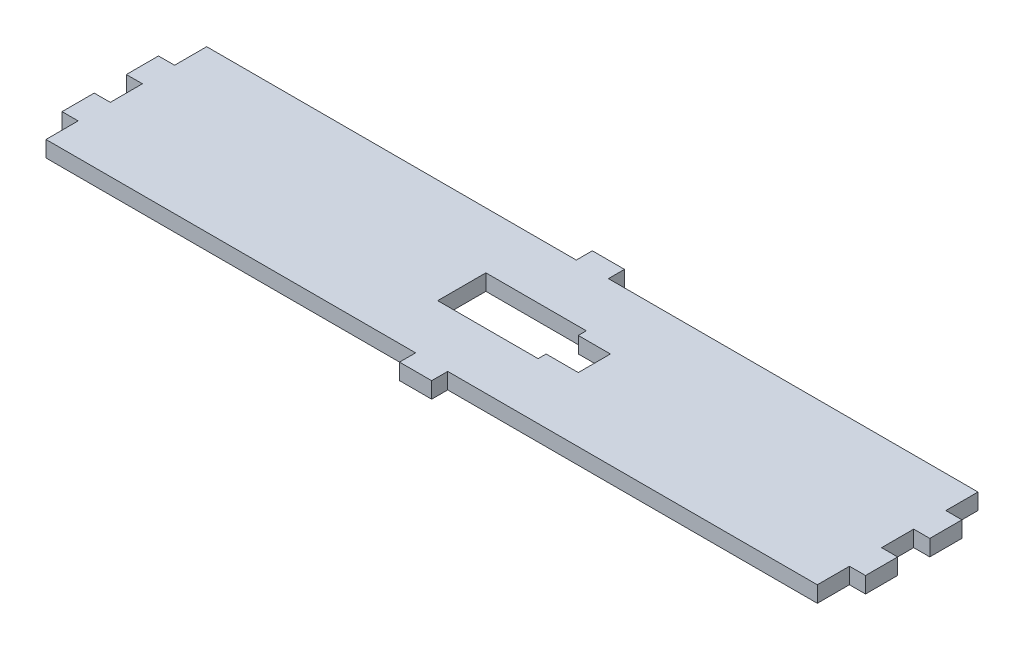
ISO-10303-21;
HEADER;
FILE_DESCRIPTION(('STEP AP214'),'2;1');
FILE_NAME('part.step','',(''),(''),'','','');
FILE_SCHEMA(('AUTOMOTIVE_DESIGN { 1 0 10303 214 1 1 1 1 }'));
ENDSEC;
DATA;
#1=APPLICATION_CONTEXT('core data for automotive mechanical design processes');
#2=APPLICATION_PROTOCOL_DEFINITION('international standard','automotive_design',2000,#1);
#3=PRODUCT_CONTEXT('',#1,'mechanical');
#4=PRODUCT('Part','Part','',(#3));
#5=PRODUCT_RELATED_PRODUCT_CATEGORY('part','',(#4));
#6=PRODUCT_DEFINITION_FORMATION('','',#4);
#7=PRODUCT_DEFINITION_CONTEXT('part definition',#1,'design');
#8=PRODUCT_DEFINITION('design','',#6,#7);
#9=PRODUCT_DEFINITION_SHAPE('','',#8);
#10=(LENGTH_UNIT() NAMED_UNIT(*) SI_UNIT(.MILLI.,.METRE.));
#11=(NAMED_UNIT(*) PLANE_ANGLE_UNIT() SI_UNIT($,.RADIAN.));
#12=(NAMED_UNIT(*) SI_UNIT($,.STERADIAN.) SOLID_ANGLE_UNIT());
#13=UNCERTAINTY_MEASURE_WITH_UNIT(LENGTH_MEASURE(1.E-05),#10,'distance_accuracy_value','');
#14=(GEOMETRIC_REPRESENTATION_CONTEXT(3) GLOBAL_UNCERTAINTY_ASSIGNED_CONTEXT((#13)) GLOBAL_UNIT_ASSIGNED_CONTEXT((#10,
#11,#12)) REPRESENTATION_CONTEXT('',''));
#15=CARTESIAN_POINT('',(0.,0.,0.));
#16=DIRECTION('',(0.,0.,1.));
#17=DIRECTION('',(1.,0.,0.));
#18=AXIS2_PLACEMENT_3D('',#15,#16,#17);
#19=CARTESIAN_POINT('',(0.,6.35,-38.1));
#20=DIRECTION('',(0.,0.,-1.));
#21=DIRECTION('',(-1.,0.,0.));
#22=AXIS2_PLACEMENT_3D('',#19,#20,#21);
#23=PLANE('',#22);
#24=DIRECTION('',(1.,0.,0.));
#25=VECTOR('',#24,1.);
#26=CARTESIAN_POINT('',(0.,0.,-38.1));
#27=LINE('',#26,#25);
#28=CARTESIAN_POINT('',(172.24375,0.,-38.1));
#29=VERTEX_POINT('',#28);
#30=CARTESIAN_POINT('',(184.94375,0.,-38.1));
#31=VERTEX_POINT('',#30);
#32=EDGE_CURVE('E373',#29,#31,#27,.T.);
#33=ORIENTED_EDGE('',*,*,#32,.T.);
#34=DIRECTION('',(0.,-1.,0.));
#35=VECTOR('',#34,1.);
#36=CARTESIAN_POINT('',(184.94375,6.35,-38.1));
#37=LINE('',#36,#35);
#38=CARTESIAN_POINT('',(184.94375,6.35,-38.1));
#39=VERTEX_POINT('',#38);
#40=EDGE_CURVE('E11',#39,#31,#37,.T.);
#41=ORIENTED_EDGE('',*,*,#40,.F.);
#42=DIRECTION('',(1.,0.,0.));
#43=VECTOR('',#42,1.);
#44=CARTESIAN_POINT('',(0.,6.35,-38.1));
#45=LINE('',#44,#43);
#46=CARTESIAN_POINT('',(172.24375,6.35,-38.1));
#47=VERTEX_POINT('',#46);
#48=EDGE_CURVE('E590',#47,#39,#45,.T.);
#49=ORIENTED_EDGE('',*,*,#48,.F.);
#50=DIRECTION('',(0.,-1.,0.));
#51=VECTOR('',#50,1.);
#52=CARTESIAN_POINT('',(172.24375,6.35,-38.1));
#53=LINE('',#52,#51);
#54=EDGE_CURVE('E390',#47,#29,#53,.T.);
#55=ORIENTED_EDGE('',*,*,#54,.T.);
#56=EDGE_LOOP('',(#33,#41,#49,#55));
#57=FACE_BOUND('',#56,.T.);
#58=ADVANCED_FACE('F37',(#57),#23,.F.);
#59=CARTESIAN_POINT('',(184.94375,6.35,0.));
#60=DIRECTION('',(1.,0.,0.));
#61=DIRECTION('',(0.,0.,-1.));
#62=AXIS2_PLACEMENT_3D('',#59,#60,#61);
#63=PLANE('',#62);
#64=DIRECTION('',(0.,0.,1.));
#65=VECTOR('',#64,1.);
#66=CARTESIAN_POINT('',(184.94375,0.,0.));
#67=LINE('',#66,#65);
#68=CARTESIAN_POINT('',(184.94375,0.,-25.4));
#69=VERTEX_POINT('',#68);
#70=EDGE_CURVE('E376',#31,#69,#67,.T.);
#71=ORIENTED_EDGE('',*,*,#70,.T.);
#72=DIRECTION('',(0.,-1.,0.));
#73=VECTOR('',#72,1.);
#74=CARTESIAN_POINT('',(184.94375,6.35,-25.4));
#75=LINE('',#74,#73);
#76=CARTESIAN_POINT('',(184.94375,6.35,-25.4));
#77=VERTEX_POINT('',#76);
#78=EDGE_CURVE('E47',#77,#69,#75,.T.);
#79=ORIENTED_EDGE('',*,*,#78,.F.);
#80=DIRECTION('',(0.,0.,1.));
#81=VECTOR('',#80,1.);
#82=CARTESIAN_POINT('',(184.94375,6.35,0.));
#83=LINE('',#82,#81);
#84=EDGE_CURVE('E592',#39,#77,#83,.T.);
#85=ORIENTED_EDGE('',*,*,#84,.F.);
#86=ORIENTED_EDGE('',*,*,#40,.T.);
#87=EDGE_LOOP('',(#71,#79,#85,#86));
#88=FACE_BOUND('',#87,.T.);
#89=ADVANCED_FACE('F643',(#88),#63,.F.);
#90=CARTESIAN_POINT('',(0.,6.35,-25.4));
#91=DIRECTION('',(0.,0.,-1.));
#92=DIRECTION('',(-1.,0.,0.));
#93=AXIS2_PLACEMENT_3D('',#90,#91,#92);
#94=PLANE('',#93);
#95=DIRECTION('',(1.,0.,0.));
#96=VECTOR('',#95,1.);
#97=CARTESIAN_POINT('',(0.,0.,-25.4));
#98=LINE('',#97,#96);
#99=CARTESIAN_POINT('',(172.24375,0.,-25.4));
#100=VERTEX_POINT('',#99);
#101=EDGE_CURVE('E379',#100,#69,#98,.T.);
#102=ORIENTED_EDGE('',*,*,#101,.F.);
#103=DIRECTION('',(0.,-1.,0.));
#104=VECTOR('',#103,1.);
#105=CARTESIAN_POINT('',(172.24375,6.35,-25.4));
#106=LINE('',#105,#104);
#107=CARTESIAN_POINT('',(172.24375,6.35,-25.4));
#108=VERTEX_POINT('',#107);
#109=EDGE_CURVE('E396',#108,#100,#106,.T.);
#110=ORIENTED_EDGE('',*,*,#109,.F.);
#111=DIRECTION('',(1.,0.,0.));
#112=VECTOR('',#111,1.);
#113=CARTESIAN_POINT('',(0.,6.35,-25.4));
#114=LINE('',#113,#112);
#115=EDGE_CURVE('E594',#108,#77,#114,.T.);
#116=ORIENTED_EDGE('',*,*,#115,.T.);
#117=ORIENTED_EDGE('',*,*,#78,.T.);
#118=EDGE_LOOP('',(#102,#110,#116,#117));
#119=FACE_BOUND('',#118,.T.);
#120=ADVANCED_FACE('F649',(#119),#94,.T.);
#121=CARTESIAN_POINT('',(172.24375,6.35,0.));
#122=DIRECTION('',(1.,0.,0.));
#123=DIRECTION('',(0.,0.,-1.));
#124=AXIS2_PLACEMENT_3D('',#121,#122,#123);
#125=PLANE('',#124);
#126=DIRECTION('',(0.,0.,1.));
#127=VECTOR('',#126,1.);
#128=CARTESIAN_POINT('',(172.24375,0.,0.));
#129=LINE('',#128,#127);
#130=CARTESIAN_POINT('',(172.24375,0.,-22.225));
#131=VERTEX_POINT('',#130);
#132=EDGE_CURVE('E382',#100,#131,#129,.T.);
#133=ORIENTED_EDGE('',*,*,#132,.T.);
#134=DIRECTION('',(0.,-1.,0.));
#135=VECTOR('',#134,1.);
#136=CARTESIAN_POINT('',(172.24375,6.35,-22.225));
#137=LINE('',#136,#135);
#138=CARTESIAN_POINT('',(172.24375,6.35,-22.225));
#139=VERTEX_POINT('',#138);
#140=EDGE_CURVE('E394',#139,#131,#137,.T.);
#141=ORIENTED_EDGE('',*,*,#140,.F.);
#142=DIRECTION('',(0.,0.,1.));
#143=VECTOR('',#142,1.);
#144=CARTESIAN_POINT('',(172.24375,6.35,0.));
#145=LINE('',#144,#143);
#146=EDGE_CURVE('E301',#108,#139,#145,.T.);
#147=ORIENTED_EDGE('',*,*,#146,.F.);
#148=ORIENTED_EDGE('',*,*,#109,.T.);
#149=EDGE_LOOP('',(#133,#141,#147,#148));
#150=FACE_BOUND('',#149,.T.);
#151=ADVANCED_FACE('F600',(#150),#125,.F.);
#152=CARTESIAN_POINT('',(0.,6.35,-22.225));
#153=DIRECTION('',(0.,0.,-1.));
#154=DIRECTION('',(-1.,0.,0.));
#155=AXIS2_PLACEMENT_3D('',#152,#153,#154);
#156=PLANE('',#155);
#157=DIRECTION('',(1.,0.,0.));
#158=VECTOR('',#157,1.);
#159=CARTESIAN_POINT('',(0.,0.,-22.225));
#160=LINE('',#159,#158);
#161=CARTESIAN_POINT('',(132.55625,0.,-22.225));
#162=VERTEX_POINT('',#161);
#163=EDGE_CURVE('E385',#162,#131,#160,.T.);
#164=ORIENTED_EDGE('',*,*,#163,.F.);
#165=DIRECTION('',(0.,-1.,0.));
#166=VECTOR('',#165,1.);
#167=CARTESIAN_POINT('',(132.55625,6.35,-22.225));
#168=LINE('',#167,#166);
#169=CARTESIAN_POINT('',(132.55625,6.35,-22.225));
#170=VERTEX_POINT('',#169);
#171=EDGE_CURVE('E290',#170,#162,#168,.T.);
#172=ORIENTED_EDGE('',*,*,#171,.F.);
#173=DIRECTION('',(1.,0.,0.));
#174=VECTOR('',#173,1.);
#175=CARTESIAN_POINT('',(0.,6.35,-22.225));
#176=LINE('',#175,#174);
#177=EDGE_CURVE('E299',#170,#139,#176,.T.);
#178=ORIENTED_EDGE('',*,*,#177,.T.);
#179=ORIENTED_EDGE('',*,*,#140,.T.);
#180=EDGE_LOOP('',(#164,#172,#178,#179));
#181=FACE_BOUND('',#180,.T.);
#182=ADVANCED_FACE('F604',(#181),#156,.T.);
#183=CARTESIAN_POINT('',(132.55625,6.35,0.));
#184=DIRECTION('',(1.,0.,0.));
#185=DIRECTION('',(0.,0.,-1.));
#186=AXIS2_PLACEMENT_3D('',#183,#184,#185);
#187=PLANE('',#186);
#188=DIRECTION('',(0.,0.,1.));
#189=VECTOR('',#188,1.);
#190=CARTESIAN_POINT('',(132.55625,0.,0.));
#191=LINE('',#190,#189);
#192=CARTESIAN_POINT('',(132.55625,0.,-41.275));
#193=VERTEX_POINT('',#192);
#194=EDGE_CURVE('E289',#193,#162,#191,.T.);
#195=ORIENTED_EDGE('',*,*,#194,.F.);
#196=DIRECTION('',(0.,-1.,0.));
#197=VECTOR('',#196,1.);
#198=CARTESIAN_POINT('',(132.55625,6.35,-41.275));
#199=LINE('',#198,#197);
#200=CARTESIAN_POINT('',(132.55625,6.35,-41.275));
#201=VERTEX_POINT('',#200);
#202=EDGE_CURVE('E283',#201,#193,#199,.T.);
#203=ORIENTED_EDGE('',*,*,#202,.F.);
#204=DIRECTION('',(0.,0.,1.));
#205=VECTOR('',#204,1.);
#206=CARTESIAN_POINT('',(132.55625,6.35,0.));
#207=LINE('',#206,#205);
#208=EDGE_CURVE('E287',#201,#170,#207,.T.);
#209=ORIENTED_EDGE('',*,*,#208,.T.);
#210=ORIENTED_EDGE('',*,*,#171,.T.);
#211=EDGE_LOOP('',(#195,#203,#209,#210));
#212=FACE_BOUND('',#211,.T.);
#213=ADVANCED_FACE('F285',(#212),#187,.T.);
#214=CARTESIAN_POINT('',(0.,6.35,-41.275));
#215=DIRECTION('',(0.,0.,-1.));
#216=DIRECTION('',(-1.,0.,0.));
#217=AXIS2_PLACEMENT_3D('',#214,#215,#216);
#218=PLANE('',#217);
#219=DIRECTION('',(1.,0.,0.));
#220=VECTOR('',#219,1.);
#221=CARTESIAN_POINT('',(0.,0.,-41.275));
#222=LINE('',#221,#220);
#223=CARTESIAN_POINT('',(172.24375,0.,-41.275));
#224=VERTEX_POINT('',#223);
#225=EDGE_CURVE('E168',#193,#224,#222,.T.);
#226=ORIENTED_EDGE('',*,*,#225,.T.);
#227=DIRECTION('',(0.,-1.,0.));
#228=VECTOR('',#227,1.);
#229=CARTESIAN_POINT('',(172.24375,6.35,-41.275));
#230=LINE('',#229,#228);
#231=CARTESIAN_POINT('',(172.24375,6.35,-41.275));
#232=VERTEX_POINT('',#231);
#233=EDGE_CURVE('E291',#232,#224,#230,.T.);
#234=ORIENTED_EDGE('',*,*,#233,.F.);
#235=DIRECTION('',(1.,0.,0.));
#236=VECTOR('',#235,1.);
#237=CARTESIAN_POINT('',(0.,6.35,-41.275));
#238=LINE('',#237,#236);
#239=EDGE_CURVE('E293',#201,#232,#238,.T.);
#240=ORIENTED_EDGE('',*,*,#239,.F.);
#241=ORIENTED_EDGE('',*,*,#202,.T.);
#242=EDGE_LOOP('',(#226,#234,#240,#241));
#243=FACE_BOUND('',#242,.T.);
#244=ADVANCED_FACE('F294',(#243),#218,.F.);
#245=CARTESIAN_POINT('',(0.,6.35,0.));
#246=DIRECTION('',(0.,0.,-1.));
#247=DIRECTION('',(-1.,0.,0.));
#248=AXIS2_PLACEMENT_3D('',#245,#246,#247);
#249=PLANE('',#248);
#250=DIRECTION('',(1.,0.,0.));
#251=VECTOR('',#250,1.);
#252=CARTESIAN_POINT('',(0.,0.,0.));
#253=LINE('',#252,#251);
#254=CARTESIAN_POINT('',(0.,0.,0.));
#255=VERTEX_POINT('',#254);
#256=CARTESIAN_POINT('',(146.05,0.,0.));
#257=VERTEX_POINT('',#256);
#258=EDGE_CURVE('E305',#255,#257,#253,.T.);
#259=ORIENTED_EDGE('',*,*,#258,.T.);
#260=DIRECTION('',(0.,-1.,0.));
#261=VECTOR('',#260,1.);
#262=CARTESIAN_POINT('',(146.05,6.35,0.));
#263=LINE('',#262,#261);
#264=CARTESIAN_POINT('',(146.05,6.35,0.));
#265=VERTEX_POINT('',#264);
#266=EDGE_CURVE('E41',#265,#257,#263,.T.);
#267=ORIENTED_EDGE('',*,*,#266,.F.);
#268=DIRECTION('',(1.,0.,0.));
#269=VECTOR('',#268,1.);
#270=CARTESIAN_POINT('',(0.,6.35,0.));
#271=LINE('',#270,#269);
#272=CARTESIAN_POINT('',(0.,6.35,0.));
#273=VERTEX_POINT('',#272);
#274=EDGE_CURVE('E606',#273,#265,#271,.T.);
#275=ORIENTED_EDGE('',*,*,#274,.F.);
#276=DIRECTION('',(0.,-1.,0.));
#277=VECTOR('',#276,1.);
#278=CARTESIAN_POINT('',(0.,6.35,0.));
#279=LINE('',#278,#277);
#280=EDGE_CURVE('E399',#273,#255,#279,.T.);
#281=ORIENTED_EDGE('',*,*,#280,.T.);
#282=EDGE_LOOP('',(#259,#267,#275,#281));
#283=FACE_BOUND('',#282,.T.);
#284=ADVANCED_FACE('F464',(#283),#249,.F.);
#285=CARTESIAN_POINT('',(146.05,6.35,0.));
#286=DIRECTION('',(1.,0.,0.));
#287=DIRECTION('',(0.,0.,-1.));
#288=AXIS2_PLACEMENT_3D('',#285,#286,#287);
#289=PLANE('',#288);
#290=DIRECTION('',(0.,0.,1.));
#291=VECTOR('',#290,1.);
#292=CARTESIAN_POINT('',(146.05,0.,0.));
#293=LINE('',#292,#291);
#294=CARTESIAN_POINT('',(146.05,0.,6.35));
#295=VERTEX_POINT('',#294);
#296=EDGE_CURVE('E308',#257,#295,#293,.T.);
#297=ORIENTED_EDGE('',*,*,#296,.T.);
#298=DIRECTION('',(0.,-1.,0.));
#299=VECTOR('',#298,1.);
#300=CARTESIAN_POINT('',(146.05,6.35,6.35));
#301=LINE('',#300,#299);
#302=CARTESIAN_POINT('',(146.05,6.35,6.35));
#303=VERTEX_POINT('',#302);
#304=EDGE_CURVE('E455',#303,#295,#301,.T.);
#305=ORIENTED_EDGE('',*,*,#304,.F.);
#306=DIRECTION('',(0.,0.,1.));
#307=VECTOR('',#306,1.);
#308=CARTESIAN_POINT('',(146.05,6.35,0.));
#309=LINE('',#308,#307);
#310=EDGE_CURVE('E183',#265,#303,#309,.T.);
#311=ORIENTED_EDGE('',*,*,#310,.F.);
#312=ORIENTED_EDGE('',*,*,#266,.T.);
#313=EDGE_LOOP('',(#297,#305,#311,#312));
#314=FACE_BOUND('',#313,.T.);
#315=ADVANCED_FACE('F39',(#314),#289,.F.);
#316=CARTESIAN_POINT('',(0.,6.35,6.34999999999998));
#317=DIRECTION('',(0.,0.,-1.));
#318=DIRECTION('',(-1.,0.,0.));
#319=AXIS2_PLACEMENT_3D('',#316,#317,#318);
#320=PLANE('',#319);
#321=DIRECTION('',(1.,0.,0.));
#322=VECTOR('',#321,1.);
#323=CARTESIAN_POINT('',(0.,0.,6.34999999999998));
#324=LINE('',#323,#322);
#325=CARTESIAN_POINT('',(158.75,0.,6.35));
#326=VERTEX_POINT('',#325);
#327=EDGE_CURVE('E311',#295,#326,#324,.T.);
#328=ORIENTED_EDGE('',*,*,#327,.T.);
#329=DIRECTION('',(0.,-1.,0.));
#330=VECTOR('',#329,1.);
#331=CARTESIAN_POINT('',(158.75,6.35,6.35));
#332=LINE('',#331,#330);
#333=CARTESIAN_POINT('',(158.75,6.35,6.35));
#334=VERTEX_POINT('',#333);
#335=EDGE_CURVE('E454',#334,#326,#332,.T.);
#336=ORIENTED_EDGE('',*,*,#335,.F.);
#337=DIRECTION('',(1.,0.,0.));
#338=VECTOR('',#337,1.);
#339=CARTESIAN_POINT('',(0.,6.35,6.34999999999998));
#340=LINE('',#339,#338);
#341=EDGE_CURVE('E610',#303,#334,#340,.T.);
#342=ORIENTED_EDGE('',*,*,#341,.F.);
#343=ORIENTED_EDGE('',*,*,#304,.T.);
#344=EDGE_LOOP('',(#328,#336,#342,#343));
#345=FACE_BOUND('',#344,.T.);
#346=ADVANCED_FACE('F782',(#345),#320,.F.);
#347=CARTESIAN_POINT('',(158.75,6.35,0.));
#348=DIRECTION('',(1.,0.,0.));
#349=DIRECTION('',(0.,0.,-1.));
#350=AXIS2_PLACEMENT_3D('',#347,#348,#349);
#351=PLANE('',#350);
#352=DIRECTION('',(0.,0.,1.));
#353=VECTOR('',#352,1.);
#354=CARTESIAN_POINT('',(158.75,0.,0.));
#355=LINE('',#354,#353);
#356=CARTESIAN_POINT('',(158.75,0.,0.));
#357=VERTEX_POINT('',#356);
#358=EDGE_CURVE('E314',#357,#326,#355,.T.);
#359=ORIENTED_EDGE('',*,*,#358,.F.);
#360=DIRECTION('',(0.,-1.,0.));
#361=VECTOR('',#360,1.);
#362=CARTESIAN_POINT('',(158.75,6.35,0.));
#363=LINE('',#362,#361);
#364=CARTESIAN_POINT('',(158.75,6.35,0.));
#365=VERTEX_POINT('',#364);
#366=EDGE_CURVE('E452',#365,#357,#363,.T.);
#367=ORIENTED_EDGE('',*,*,#366,.F.);
#368=DIRECTION('',(0.,0.,1.));
#369=VECTOR('',#368,1.);
#370=CARTESIAN_POINT('',(158.75,6.35,0.));
#371=LINE('',#370,#369);
#372=EDGE_CURVE('E613',#365,#334,#371,.T.);
#373=ORIENTED_EDGE('',*,*,#372,.T.);
#374=ORIENTED_EDGE('',*,*,#335,.T.);
#375=EDGE_LOOP('',(#359,#367,#373,#374));
#376=FACE_BOUND('',#375,.T.);
#377=ADVANCED_FACE('F770',(#376),#351,.T.);
#378=CARTESIAN_POINT('',(304.8,0.,0.));
#379=VERTEX_POINT('',#378);
#380=EDGE_CURVE('E309',#357,#379,#253,.T.);
#381=ORIENTED_EDGE('',*,*,#380,.T.);
#382=DIRECTION('',(0.,-1.,0.));
#383=VECTOR('',#382,1.);
#384=CARTESIAN_POINT('',(304.8,6.35,0.));
#385=LINE('',#384,#383);
#386=CARTESIAN_POINT('',(304.8,6.35,0.));
#387=VERTEX_POINT('',#386);
#388=EDGE_CURVE('E449',#387,#379,#385,.T.);
#389=ORIENTED_EDGE('',*,*,#388,.F.);
#390=EDGE_CURVE('E608',#365,#387,#271,.T.);
#391=ORIENTED_EDGE('',*,*,#390,.F.);
#392=ORIENTED_EDGE('',*,*,#366,.T.);
#393=EDGE_LOOP('',(#381,#389,#391,#392));
#394=FACE_BOUND('',#393,.T.);
#395=ADVANCED_FACE('F760',(#394),#249,.F.);
#396=CARTESIAN_POINT('',(304.8,6.35,0.));
#397=DIRECTION('',(-1.,0.,0.));
#398=DIRECTION('',(0.,0.,1.));
#399=AXIS2_PLACEMENT_3D('',#396,#397,#398);
#400=PLANE('',#399);
#401=DIRECTION('',(0.,0.,-1.));
#402=VECTOR('',#401,1.);
#403=CARTESIAN_POINT('',(304.8,0.,0.));
#404=LINE('',#403,#402);
#405=CARTESIAN_POINT('',(304.8,0.,-12.7));
#406=VERTEX_POINT('',#405);
#407=EDGE_CURVE('E317',#379,#406,#404,.T.);
#408=ORIENTED_EDGE('',*,*,#407,.T.);
#409=DIRECTION('',(0.,-1.,0.));
#410=VECTOR('',#409,1.);
#411=CARTESIAN_POINT('',(304.8,6.35,-12.7));
#412=LINE('',#411,#410);
#413=CARTESIAN_POINT('',(304.8,6.35,-12.7));
#414=VERTEX_POINT('',#413);
#415=EDGE_CURVE('E446',#414,#406,#412,.T.);
#416=ORIENTED_EDGE('',*,*,#415,.F.);
#417=DIRECTION('',(0.,0.,-1.));
#418=VECTOR('',#417,1.);
#419=CARTESIAN_POINT('',(304.8,6.35,0.));
#420=LINE('',#419,#418);
#421=EDGE_CURVE('E612',#387,#414,#420,.T.);
#422=ORIENTED_EDGE('',*,*,#421,.F.);
#423=ORIENTED_EDGE('',*,*,#388,.T.);
#424=EDGE_LOOP('',(#408,#416,#422,#423));
#425=FACE_BOUND('',#424,.T.);
#426=ADVANCED_FACE('F640',(#425),#400,.F.);
#427=CARTESIAN_POINT('',(0.,6.35,-12.7));
#428=DIRECTION('',(0.,0.,-1.));
#429=DIRECTION('',(-1.,0.,0.));
#430=AXIS2_PLACEMENT_3D('',#427,#428,#429);
#431=PLANE('',#430);
#432=DIRECTION('',(1.,0.,0.));
#433=VECTOR('',#432,1.);
#434=CARTESIAN_POINT('',(0.,0.,-12.7));
#435=LINE('',#434,#433);
#436=CARTESIAN_POINT('',(311.15,0.,-12.7));
#437=VERTEX_POINT('',#436);
#438=EDGE_CURVE('E319',#406,#437,#435,.T.);
#439=ORIENTED_EDGE('',*,*,#438,.T.);
#440=DIRECTION('',(0.,-1.,0.));
#441=VECTOR('',#440,1.);
#442=CARTESIAN_POINT('',(311.15,6.35,-12.7));
#443=LINE('',#442,#441);
#444=CARTESIAN_POINT('',(311.15,6.35,-12.7));
#445=VERTEX_POINT('',#444);
#446=EDGE_CURVE('E444',#445,#437,#443,.T.);
#447=ORIENTED_EDGE('',*,*,#446,.F.);
#448=DIRECTION('',(1.,0.,0.));
#449=VECTOR('',#448,1.);
#450=CARTESIAN_POINT('',(0.,6.35,-12.7));
#451=LINE('',#450,#449);
#452=EDGE_CURVE('E617',#414,#445,#451,.T.);
#453=ORIENTED_EDGE('',*,*,#452,.F.);
#454=ORIENTED_EDGE('',*,*,#415,.T.);
#455=EDGE_LOOP('',(#439,#447,#453,#454));
#456=FACE_BOUND('',#455,.T.);
#457=ADVANCED_FACE('F741',(#456),#431,.F.);
#458=CARTESIAN_POINT('',(311.15,6.35,0.));
#459=DIRECTION('',(1.,0.,0.));
#460=DIRECTION('',(0.,0.,-1.));
#461=AXIS2_PLACEMENT_3D('',#458,#459,#460);
#462=PLANE('',#461);
#463=DIRECTION('',(0.,0.,1.));
#464=VECTOR('',#463,1.);
#465=CARTESIAN_POINT('',(311.15,0.,0.));
#466=LINE('',#465,#464);
#467=CARTESIAN_POINT('',(311.15,0.,-25.4));
#468=VERTEX_POINT('',#467);
#469=EDGE_CURVE('E324',#468,#437,#466,.T.);
#470=ORIENTED_EDGE('',*,*,#469,.F.);
#471=DIRECTION('',(0.,-1.,0.));
#472=VECTOR('',#471,1.);
#473=CARTESIAN_POINT('',(311.15,6.35,-25.4));
#474=LINE('',#473,#472);
#475=CARTESIAN_POINT('',(311.15,6.35,-25.4));
#476=VERTEX_POINT('',#475);
#477=EDGE_CURVE('E442',#476,#468,#474,.T.);
#478=ORIENTED_EDGE('',*,*,#477,.F.);
#479=DIRECTION('',(0.,0.,1.));
#480=VECTOR('',#479,1.);
#481=CARTESIAN_POINT('',(311.15,6.35,0.));
#482=LINE('',#481,#480);
#483=EDGE_CURVE('E625',#476,#445,#482,.T.);
#484=ORIENTED_EDGE('',*,*,#483,.T.);
#485=ORIENTED_EDGE('',*,*,#446,.T.);
#486=EDGE_LOOP('',(#470,#478,#484,#485));
#487=FACE_BOUND('',#486,.T.);
#488=ADVANCED_FACE('F731',(#487),#462,.T.);
#489=CARTESIAN_POINT('',(0.,6.35,-25.4));
#490=DIRECTION('',(0.,0.,-1.));
#491=DIRECTION('',(-1.,0.,0.));
#492=AXIS2_PLACEMENT_3D('',#489,#490,#491);
#493=PLANE('',#492);
#494=DIRECTION('',(1.,0.,0.));
#495=VECTOR('',#494,1.);
#496=CARTESIAN_POINT('',(0.,0.,-25.4));
#497=LINE('',#496,#495);
#498=CARTESIAN_POINT('',(304.8,0.,-25.4));
#499=VERTEX_POINT('',#498);
#500=EDGE_CURVE('E327',#499,#468,#497,.T.);
#501=ORIENTED_EDGE('',*,*,#500,.F.);
#502=DIRECTION('',(0.,-1.,0.));
#503=VECTOR('',#502,1.);
#504=CARTESIAN_POINT('',(304.8,6.35,-25.4));
#505=LINE('',#504,#503);
#506=CARTESIAN_POINT('',(304.8,6.35,-25.4));
#507=VERTEX_POINT('',#506);
#508=EDGE_CURVE('E440',#507,#499,#505,.T.);
#509=ORIENTED_EDGE('',*,*,#508,.F.);
#510=DIRECTION('',(1.,0.,0.));
#511=VECTOR('',#510,1.);
#512=CARTESIAN_POINT('',(0.,6.35,-25.4));
#513=LINE('',#512,#511);
#514=EDGE_CURVE('E627',#507,#476,#513,.T.);
#515=ORIENTED_EDGE('',*,*,#514,.T.);
#516=ORIENTED_EDGE('',*,*,#477,.T.);
#517=EDGE_LOOP('',(#501,#509,#515,#516));
#518=FACE_BOUND('',#517,.T.);
#519=ADVANCED_FACE('F722',(#518),#493,.T.);
#520=CARTESIAN_POINT('',(304.8,0.,-38.1));
#521=VERTEX_POINT('',#520);
#522=EDGE_CURVE('E321',#499,#521,#404,.T.);
#523=ORIENTED_EDGE('',*,*,#522,.T.);
#524=DIRECTION('',(0.,-1.,0.));
#525=VECTOR('',#524,1.);
#526=CARTESIAN_POINT('',(304.8,6.35,-38.1));
#527=LINE('',#526,#525);
#528=CARTESIAN_POINT('',(304.8,6.35,-38.1));
#529=VERTEX_POINT('',#528);
#530=EDGE_CURVE('E437',#529,#521,#527,.T.);
#531=ORIENTED_EDGE('',*,*,#530,.F.);
#532=EDGE_CURVE('E566',#507,#529,#420,.T.);
#533=ORIENTED_EDGE('',*,*,#532,.F.);
#534=ORIENTED_EDGE('',*,*,#508,.T.);
#535=EDGE_LOOP('',(#523,#531,#533,#534));
#536=FACE_BOUND('',#535,.T.);
#537=ADVANCED_FACE('F544',(#536),#400,.F.);
#538=CARTESIAN_POINT('',(0.,6.35,-38.1));
#539=DIRECTION('',(0.,0.,-1.));
#540=DIRECTION('',(-1.,0.,0.));
#541=AXIS2_PLACEMENT_3D('',#538,#539,#540);
#542=PLANE('',#541);
#543=DIRECTION('',(1.,0.,0.));
#544=VECTOR('',#543,1.);
#545=CARTESIAN_POINT('',(0.,0.,-38.1));
#546=LINE('',#545,#544);
#547=CARTESIAN_POINT('',(311.15,0.,-38.1));
#548=VERTEX_POINT('',#547);
#549=EDGE_CURVE('E330',#521,#548,#546,.T.);
#550=ORIENTED_EDGE('',*,*,#549,.T.);
#551=DIRECTION('',(0.,-1.,0.));
#552=VECTOR('',#551,1.);
#553=CARTESIAN_POINT('',(311.15,6.35,-38.1));
#554=LINE('',#553,#552);
#555=CARTESIAN_POINT('',(311.15,6.35,-38.1));
#556=VERTEX_POINT('',#555);
#557=EDGE_CURVE('E435',#556,#548,#554,.T.);
#558=ORIENTED_EDGE('',*,*,#557,.F.);
#559=DIRECTION('',(1.,0.,0.));
#560=VECTOR('',#559,1.);
#561=CARTESIAN_POINT('',(0.,6.35,-38.1));
#562=LINE('',#561,#560);
#563=EDGE_CURVE('E552',#529,#556,#562,.T.);
#564=ORIENTED_EDGE('',*,*,#563,.F.);
#565=ORIENTED_EDGE('',*,*,#530,.T.);
#566=EDGE_LOOP('',(#550,#558,#564,#565));
#567=FACE_BOUND('',#566,.T.);
#568=ADVANCED_FACE('F550',(#567),#542,.F.);
#569=CARTESIAN_POINT('',(311.15,6.35,1.36002320516582E-12));
#570=DIRECTION('',(1.,0.,0.));
#571=DIRECTION('',(0.,0.,-1.));
#572=AXIS2_PLACEMENT_3D('',#569,#570,#571);
#573=PLANE('',#572);
#574=DIRECTION('',(0.,0.,1.));
#575=VECTOR('',#574,1.);
#576=CARTESIAN_POINT('',(311.15,0.,1.36002320516582E-12));
#577=LINE('',#576,#575);
#578=CARTESIAN_POINT('',(311.15,0.,-50.8));
#579=VERTEX_POINT('',#578);
#580=EDGE_CURVE('E333',#579,#548,#577,.T.);
#581=ORIENTED_EDGE('',*,*,#580,.F.);
#582=DIRECTION('',(0.,-1.,0.));
#583=VECTOR('',#582,1.);
#584=CARTESIAN_POINT('',(311.15,6.35,-50.8));
#585=LINE('',#584,#583);
#586=CARTESIAN_POINT('',(311.15,6.35,-50.8));
#587=VERTEX_POINT('',#586);
#588=EDGE_CURVE('E433',#587,#579,#585,.T.);
#589=ORIENTED_EDGE('',*,*,#588,.F.);
#590=DIRECTION('',(0.,0.,1.));
#591=VECTOR('',#590,1.);
#592=CARTESIAN_POINT('',(311.15,6.35,1.36002320516582E-12));
#593=LINE('',#592,#591);
#594=EDGE_CURVE('E558',#587,#556,#593,.T.);
#595=ORIENTED_EDGE('',*,*,#594,.T.);
#596=ORIENTED_EDGE('',*,*,#557,.T.);
#597=EDGE_LOOP('',(#581,#589,#595,#596));
#598=FACE_BOUND('',#597,.T.);
#599=ADVANCED_FACE('F555',(#598),#573,.T.);
#600=CARTESIAN_POINT('',(0.,6.35,-50.8));
#601=DIRECTION('',(0.,0.,-1.));
#602=DIRECTION('',(-1.,0.,0.));
#603=AXIS2_PLACEMENT_3D('',#600,#601,#602);
#604=PLANE('',#603);
#605=DIRECTION('',(1.,0.,0.));
#606=VECTOR('',#605,1.);
#607=CARTESIAN_POINT('',(0.,0.,-50.8));
#608=LINE('',#607,#606);
#609=CARTESIAN_POINT('',(304.8,0.,-50.8));
#610=VERTEX_POINT('',#609);
#611=EDGE_CURVE('E336',#610,#579,#608,.T.);
#612=ORIENTED_EDGE('',*,*,#611,.F.);
#613=DIRECTION('',(0.,-1.,0.));
#614=VECTOR('',#613,1.);
#615=CARTESIAN_POINT('',(304.8,6.35,-50.8));
#616=LINE('',#615,#614);
#617=CARTESIAN_POINT('',(304.8,6.35,-50.8));
#618=VERTEX_POINT('',#617);
#619=EDGE_CURVE('E431',#618,#610,#616,.T.);
#620=ORIENTED_EDGE('',*,*,#619,.F.);
#621=DIRECTION('',(1.,0.,0.));
#622=VECTOR('',#621,1.);
#623=CARTESIAN_POINT('',(0.,6.35,-50.8));
#624=LINE('',#623,#622);
#625=EDGE_CURVE('E562',#618,#587,#624,.T.);
#626=ORIENTED_EDGE('',*,*,#625,.T.);
#627=ORIENTED_EDGE('',*,*,#588,.T.);
#628=EDGE_LOOP('',(#612,#620,#626,#627));
#629=FACE_BOUND('',#628,.T.);
#630=ADVANCED_FACE('F632',(#629),#604,.T.);
#631=CARTESIAN_POINT('',(304.8,0.,-63.5));
#632=VERTEX_POINT('',#631);
#633=EDGE_CURVE('E320',#610,#632,#404,.T.);
#634=ORIENTED_EDGE('',*,*,#633,.T.);
#635=DIRECTION('',(0.,-1.,0.));
#636=VECTOR('',#635,1.);
#637=CARTESIAN_POINT('',(304.8,6.35,-63.5));
#638=LINE('',#637,#636);
#639=CARTESIAN_POINT('',(304.8,6.35,-63.5));
#640=VERTEX_POINT('',#639);
#641=EDGE_CURVE('E429',#640,#632,#638,.T.);
#642=ORIENTED_EDGE('',*,*,#641,.F.);
#643=EDGE_CURVE('E564',#618,#640,#420,.T.);
#644=ORIENTED_EDGE('',*,*,#643,.F.);
#645=ORIENTED_EDGE('',*,*,#619,.T.);
#646=EDGE_LOOP('',(#634,#642,#644,#645));
#647=FACE_BOUND('',#646,.T.);
#648=ADVANCED_FACE('F539',(#647),#400,.F.);
#649=CARTESIAN_POINT('',(0.,6.35,-63.5));
#650=DIRECTION('',(0.,0.,-1.));
#651=DIRECTION('',(-1.,0.,0.));
#652=AXIS2_PLACEMENT_3D('',#649,#650,#651);
#653=PLANE('',#652);
#654=DIRECTION('',(1.,0.,0.));
#655=VECTOR('',#654,1.);
#656=CARTESIAN_POINT('',(0.,0.,-63.5));
#657=LINE('',#656,#655);
#658=CARTESIAN_POINT('',(158.75,0.,-63.5));
#659=VERTEX_POINT('',#658);
#660=EDGE_CURVE('E339',#659,#632,#657,.T.);
#661=ORIENTED_EDGE('',*,*,#660,.F.);
#662=DIRECTION('',(0.,-1.,0.));
#663=VECTOR('',#662,1.);
#664=CARTESIAN_POINT('',(158.75,6.35,-63.5));
#665=LINE('',#664,#663);
#666=CARTESIAN_POINT('',(158.75,6.35,-63.5));
#667=VERTEX_POINT('',#666);
#668=EDGE_CURVE('E427',#667,#659,#665,.T.);
#669=ORIENTED_EDGE('',*,*,#668,.F.);
#670=DIRECTION('',(1.,0.,0.));
#671=VECTOR('',#670,1.);
#672=CARTESIAN_POINT('',(0.,6.35,-63.5));
#673=LINE('',#672,#671);
#674=EDGE_CURVE('E536',#667,#640,#673,.T.);
#675=ORIENTED_EDGE('',*,*,#674,.T.);
#676=ORIENTED_EDGE('',*,*,#641,.T.);
#677=EDGE_LOOP('',(#661,#669,#675,#676));
#678=FACE_BOUND('',#677,.T.);
#679=ADVANCED_FACE('F531',(#678),#653,.T.);
#680=CARTESIAN_POINT('',(158.75,6.35,0.));
#681=DIRECTION('',(-1.,0.,0.));
#682=DIRECTION('',(0.,0.,1.));
#683=AXIS2_PLACEMENT_3D('',#680,#681,#682);
#684=PLANE('',#683);
#685=DIRECTION('',(0.,0.,-1.));
#686=VECTOR('',#685,1.);
#687=CARTESIAN_POINT('',(158.75,0.,0.));
#688=LINE('',#687,#686);
#689=CARTESIAN_POINT('',(158.75,0.,-69.85));
#690=VERTEX_POINT('',#689);
#691=EDGE_CURVE('E342',#659,#690,#688,.T.);
#692=ORIENTED_EDGE('',*,*,#691,.T.);
#693=DIRECTION('',(0.,-1.,0.));
#694=VECTOR('',#693,1.);
#695=CARTESIAN_POINT('',(158.75,6.35,-69.85));
#696=LINE('',#695,#694);
#697=CARTESIAN_POINT('',(158.75,6.35,-69.85));
#698=VERTEX_POINT('',#697);
#699=EDGE_CURVE('E425',#698,#690,#696,.T.);
#700=ORIENTED_EDGE('',*,*,#699,.F.);
#701=DIRECTION('',(0.,0.,-1.));
#702=VECTOR('',#701,1.);
#703=CARTESIAN_POINT('',(158.75,6.35,0.));
#704=LINE('',#703,#702);
#705=EDGE_CURVE('E571',#667,#698,#704,.T.);
#706=ORIENTED_EDGE('',*,*,#705,.F.);
#707=ORIENTED_EDGE('',*,*,#668,.T.);
#708=EDGE_LOOP('',(#692,#700,#706,#707));
#709=FACE_BOUND('',#708,.T.);
#710=ADVANCED_FACE('F527',(#709),#684,.F.);
#711=CARTESIAN_POINT('',(0.,6.35,-69.85));
#712=DIRECTION('',(0.,0.,-1.));
#713=DIRECTION('',(-1.,0.,0.));
#714=AXIS2_PLACEMENT_3D('',#711,#712,#713);
#715=PLANE('',#714);
#716=DIRECTION('',(1.,0.,0.));
#717=VECTOR('',#716,1.);
#718=CARTESIAN_POINT('',(0.,0.,-69.85));
#719=LINE('',#718,#717);
#720=CARTESIAN_POINT('',(146.05,0.,-69.85));
#721=VERTEX_POINT('',#720);
#722=EDGE_CURVE('E346',#721,#690,#719,.T.);
#723=ORIENTED_EDGE('',*,*,#722,.F.);
#724=DIRECTION('',(0.,-1.,0.));
#725=VECTOR('',#724,1.);
#726=CARTESIAN_POINT('',(146.05,6.35,-69.85));
#727=LINE('',#726,#725);
#728=CARTESIAN_POINT('',(146.05,6.35,-69.85));
#729=VERTEX_POINT('',#728);
#730=EDGE_CURVE('E423',#729,#721,#727,.T.);
#731=ORIENTED_EDGE('',*,*,#730,.F.);
#732=DIRECTION('',(1.,0.,0.));
#733=VECTOR('',#732,1.);
#734=CARTESIAN_POINT('',(0.,6.35,-69.85));
#735=LINE('',#734,#733);
#736=EDGE_CURVE('E524',#729,#698,#735,.T.);
#737=ORIENTED_EDGE('',*,*,#736,.T.);
#738=ORIENTED_EDGE('',*,*,#699,.T.);
#739=EDGE_LOOP('',(#723,#731,#737,#738));
#740=FACE_BOUND('',#739,.T.);
#741=ADVANCED_FACE('F522',(#740),#715,.T.);
#742=CARTESIAN_POINT('',(146.05,6.35,0.));
#743=DIRECTION('',(-1.,0.,0.));
#744=DIRECTION('',(0.,0.,1.));
#745=AXIS2_PLACEMENT_3D('',#742,#743,#744);
#746=PLANE('',#745);
#747=DIRECTION('',(0.,0.,-1.));
#748=VECTOR('',#747,1.);
#749=CARTESIAN_POINT('',(146.05,0.,0.));
#750=LINE('',#749,#748);
#751=CARTESIAN_POINT('',(146.05,0.,-63.5));
#752=VERTEX_POINT('',#751);
#753=EDGE_CURVE('E349',#752,#721,#750,.T.);
#754=ORIENTED_EDGE('',*,*,#753,.F.);
#755=DIRECTION('',(0.,-1.,0.));
#756=VECTOR('',#755,1.);
#757=CARTESIAN_POINT('',(146.05,6.35,-63.5));
#758=LINE('',#757,#756);
#759=CARTESIAN_POINT('',(146.05,6.35,-63.5));
#760=VERTEX_POINT('',#759);
#761=EDGE_CURVE('E421',#760,#752,#758,.T.);
#762=ORIENTED_EDGE('',*,*,#761,.F.);
#763=DIRECTION('',(0.,0.,-1.));
#764=VECTOR('',#763,1.);
#765=CARTESIAN_POINT('',(146.05,6.35,0.));
#766=LINE('',#765,#764);
#767=EDGE_CURVE('E518',#760,#729,#766,.T.);
#768=ORIENTED_EDGE('',*,*,#767,.T.);
#769=ORIENTED_EDGE('',*,*,#730,.T.);
#770=EDGE_LOOP('',(#754,#762,#768,#769));
#771=FACE_BOUND('',#770,.T.);
#772=ADVANCED_FACE('F515',(#771),#746,.T.);
#773=CARTESIAN_POINT('',(0.,0.,-63.5));
#774=VERTEX_POINT('',#773);
#775=EDGE_CURVE('E343',#774,#752,#657,.T.);
#776=ORIENTED_EDGE('',*,*,#775,.F.);
#777=DIRECTION('',(0.,-1.,0.));
#778=VECTOR('',#777,1.);
#779=CARTESIAN_POINT('',(0.,6.35,-63.5));
#780=LINE('',#779,#778);
#781=CARTESIAN_POINT('',(0.,6.35,-63.5));
#782=VERTEX_POINT('',#781);
#783=EDGE_CURVE('E419',#782,#774,#780,.T.);
#784=ORIENTED_EDGE('',*,*,#783,.F.);
#785=EDGE_CURVE('E572',#782,#760,#673,.T.);
#786=ORIENTED_EDGE('',*,*,#785,.T.);
#787=ORIENTED_EDGE('',*,*,#761,.T.);
#788=EDGE_LOOP('',(#776,#784,#786,#787));
#789=FACE_BOUND('',#788,.T.);
#790=ADVANCED_FACE('F510',(#789),#653,.T.);
#791=CARTESIAN_POINT('',(0.,6.35,0.));
#792=DIRECTION('',(-1.,0.,0.));
#793=DIRECTION('',(0.,0.,1.));
#794=AXIS2_PLACEMENT_3D('',#791,#792,#793);
#795=PLANE('',#794);
#796=DIRECTION('',(0.,0.,-1.));
#797=VECTOR('',#796,1.);
#798=CARTESIAN_POINT('',(0.,0.,0.));
#799=LINE('',#798,#797);
#800=CARTESIAN_POINT('',(0.,0.,-50.8));
#801=VERTEX_POINT('',#800);
#802=EDGE_CURVE('E352',#801,#774,#799,.T.);
#803=ORIENTED_EDGE('',*,*,#802,.F.);
#804=DIRECTION('',(0.,-1.,0.));
#805=VECTOR('',#804,1.);
#806=CARTESIAN_POINT('',(0.,6.35,-50.8));
#807=LINE('',#806,#805);
#808=CARTESIAN_POINT('',(0.,6.35,-50.8));
#809=VERTEX_POINT('',#808);
#810=EDGE_CURVE('E417',#809,#801,#807,.T.);
#811=ORIENTED_EDGE('',*,*,#810,.F.);
#812=DIRECTION('',(0.,0.,-1.));
#813=VECTOR('',#812,1.);
#814=CARTESIAN_POINT('',(0.,6.35,0.));
#815=LINE('',#814,#813);
#816=EDGE_CURVE('E506',#809,#782,#815,.T.);
#817=ORIENTED_EDGE('',*,*,#816,.T.);
#818=ORIENTED_EDGE('',*,*,#783,.T.);
#819=EDGE_LOOP('',(#803,#811,#817,#818));
#820=FACE_BOUND('',#819,.T.);
#821=ADVANCED_FACE('F501',(#820),#795,.T.);
#822=CARTESIAN_POINT('',(0.,6.35,-50.8));
#823=DIRECTION('',(0.,0.,1.));
#824=DIRECTION('',(1.,0.,0.));
#825=AXIS2_PLACEMENT_3D('',#822,#823,#824);
#826=PLANE('',#825);
#827=DIRECTION('',(-1.,0.,0.));
#828=VECTOR('',#827,1.);
#829=CARTESIAN_POINT('',(0.,0.,-50.8));
#830=LINE('',#829,#828);
#831=CARTESIAN_POINT('',(-6.35000000000019,0.,-50.8));
#832=VERTEX_POINT('',#831);
#833=EDGE_CURVE('E355',#801,#832,#830,.T.);
#834=ORIENTED_EDGE('',*,*,#833,.T.);
#835=DIRECTION('',(0.,-1.,0.));
#836=VECTOR('',#835,1.);
#837=CARTESIAN_POINT('',(-6.35000000000019,6.35,-50.8));
#838=LINE('',#837,#836);
#839=CARTESIAN_POINT('',(-6.35000000000019,6.35,-50.8));
#840=VERTEX_POINT('',#839);
#841=EDGE_CURVE('E414',#840,#832,#838,.T.);
#842=ORIENTED_EDGE('',*,*,#841,.F.);
#843=DIRECTION('',(-1.,0.,0.));
#844=VECTOR('',#843,1.);
#845=CARTESIAN_POINT('',(0.,6.35,-50.8));
#846=LINE('',#845,#844);
#847=EDGE_CURVE('E577',#809,#840,#846,.T.);
#848=ORIENTED_EDGE('',*,*,#847,.F.);
#849=ORIENTED_EDGE('',*,*,#810,.T.);
#850=EDGE_LOOP('',(#834,#842,#848,#849));
#851=FACE_BOUND('',#850,.T.);
#852=ADVANCED_FACE('F673',(#851),#826,.F.);
#853=CARTESIAN_POINT('',(-6.35000000000019,6.35,0.));
#854=DIRECTION('',(1.,0.,0.));
#855=DIRECTION('',(0.,0.,-1.));
#856=AXIS2_PLACEMENT_3D('',#853,#854,#855);
#857=PLANE('',#856);
#858=DIRECTION('',(0.,0.,1.));
#859=VECTOR('',#858,1.);
#860=CARTESIAN_POINT('',(-6.35000000000019,0.,0.));
#861=LINE('',#860,#859);
#862=CARTESIAN_POINT('',(-6.35000000000019,0.,-38.1));
#863=VERTEX_POINT('',#862);
#864=EDGE_CURVE('E359',#832,#863,#861,.T.);
#865=ORIENTED_EDGE('',*,*,#864,.T.);
#866=DIRECTION('',(0.,-1.,0.));
#867=VECTOR('',#866,1.);
#868=CARTESIAN_POINT('',(-6.35000000000019,6.35,-38.1));
#869=LINE('',#868,#867);
#870=CARTESIAN_POINT('',(-6.35000000000019,6.35,-38.1));
#871=VERTEX_POINT('',#870);
#872=EDGE_CURVE('E412',#871,#863,#869,.T.);
#873=ORIENTED_EDGE('',*,*,#872,.F.);
#874=DIRECTION('',(0.,0.,1.));
#875=VECTOR('',#874,1.);
#876=CARTESIAN_POINT('',(-6.35000000000019,6.35,0.));
#877=LINE('',#876,#875);
#878=EDGE_CURVE('E580',#840,#871,#877,.T.);
#879=ORIENTED_EDGE('',*,*,#878,.F.);
#880=ORIENTED_EDGE('',*,*,#841,.T.);
#881=EDGE_LOOP('',(#865,#873,#879,#880));
#882=FACE_BOUND('',#881,.T.);
#883=ADVANCED_FACE('F494',(#882),#857,.F.);
#884=CARTESIAN_POINT('',(0.,6.35,-38.1));
#885=DIRECTION('',(0.,0.,1.));
#886=DIRECTION('',(1.,0.,0.));
#887=AXIS2_PLACEMENT_3D('',#884,#885,#886);
#888=PLANE('',#887);
#889=DIRECTION('',(-1.,0.,0.));
#890=VECTOR('',#889,1.);
#891=CARTESIAN_POINT('',(0.,0.,-38.1));
#892=LINE('',#891,#890);
#893=CARTESIAN_POINT('',(0.,0.,-38.1));
#894=VERTEX_POINT('',#893);
#895=EDGE_CURVE('E362',#894,#863,#892,.T.);
#896=ORIENTED_EDGE('',*,*,#895,.F.);
#897=DIRECTION('',(0.,-1.,0.));
#898=VECTOR('',#897,1.);
#899=CARTESIAN_POINT('',(0.,6.35,-38.1));
#900=LINE('',#899,#898);
#901=CARTESIAN_POINT('',(0.,6.35,-38.1));
#902=VERTEX_POINT('',#901);
#903=EDGE_CURVE('E410',#902,#894,#900,.T.);
#904=ORIENTED_EDGE('',*,*,#903,.F.);
#905=DIRECTION('',(-1.,0.,0.));
#906=VECTOR('',#905,1.);
#907=CARTESIAN_POINT('',(0.,6.35,-38.1));
#908=LINE('',#907,#906);
#909=EDGE_CURVE('E491',#902,#871,#908,.T.);
#910=ORIENTED_EDGE('',*,*,#909,.T.);
#911=ORIENTED_EDGE('',*,*,#872,.T.);
#912=EDGE_LOOP('',(#896,#904,#910,#911));
#913=FACE_BOUND('',#912,.T.);
#914=ADVANCED_FACE('F489',(#913),#888,.T.);
#915=CARTESIAN_POINT('',(0.,0.,-25.4));
#916=VERTEX_POINT('',#915);
#917=EDGE_CURVE('E357',#916,#894,#799,.T.);
#918=ORIENTED_EDGE('',*,*,#917,.F.);
#919=DIRECTION('',(0.,-1.,0.));
#920=VECTOR('',#919,1.);
#921=CARTESIAN_POINT('',(0.,6.35,-25.4));
#922=LINE('',#921,#920);
#923=CARTESIAN_POINT('',(0.,6.35,-25.4));
#924=VERTEX_POINT('',#923);
#925=EDGE_CURVE('E408',#924,#916,#922,.T.);
#926=ORIENTED_EDGE('',*,*,#925,.F.);
#927=EDGE_CURVE('E485',#924,#902,#815,.T.);
#928=ORIENTED_EDGE('',*,*,#927,.T.);
#929=ORIENTED_EDGE('',*,*,#903,.T.);
#930=EDGE_LOOP('',(#918,#926,#928,#929));
#931=FACE_BOUND('',#930,.T.);
#932=ADVANCED_FACE('F481',(#931),#795,.T.);
#933=CARTESIAN_POINT('',(0.,6.35,-25.4));
#934=DIRECTION('',(0.,0.,1.));
#935=DIRECTION('',(1.,0.,0.));
#936=AXIS2_PLACEMENT_3D('',#933,#934,#935);
#937=PLANE('',#936);
#938=DIRECTION('',(-1.,0.,0.));
#939=VECTOR('',#938,1.);
#940=CARTESIAN_POINT('',(0.,0.,-25.4));
#941=LINE('',#940,#939);
#942=CARTESIAN_POINT('',(-6.35000000000019,0.,-25.4));
#943=VERTEX_POINT('',#942);
#944=EDGE_CURVE('E365',#916,#943,#941,.T.);
#945=ORIENTED_EDGE('',*,*,#944,.T.);
#946=DIRECTION('',(0.,-1.,0.));
#947=VECTOR('',#946,1.);
#948=CARTESIAN_POINT('',(-6.35000000000019,6.35,-25.4));
#949=LINE('',#948,#947);
#950=CARTESIAN_POINT('',(-6.35000000000019,6.35,-25.4));
#951=VERTEX_POINT('',#950);
#952=EDGE_CURVE('E405',#951,#943,#949,.T.);
#953=ORIENTED_EDGE('',*,*,#952,.F.);
#954=DIRECTION('',(-1.,0.,0.));
#955=VECTOR('',#954,1.);
#956=CARTESIAN_POINT('',(0.,6.35,-25.4));
#957=LINE('',#956,#955);
#958=EDGE_CURVE('E583',#924,#951,#957,.T.);
#959=ORIENTED_EDGE('',*,*,#958,.F.);
#960=ORIENTED_EDGE('',*,*,#925,.T.);
#961=EDGE_LOOP('',(#945,#953,#959,#960));
#962=FACE_BOUND('',#961,.T.);
#963=ADVANCED_FACE('F664',(#962),#937,.F.);
#964=CARTESIAN_POINT('',(-6.35000000000019,6.35,0.));
#965=DIRECTION('',(1.,0.,0.));
#966=DIRECTION('',(0.,0.,-1.));
#967=AXIS2_PLACEMENT_3D('',#964,#965,#966);
#968=PLANE('',#967);
#969=DIRECTION('',(0.,0.,1.));
#970=VECTOR('',#969,1.);
#971=CARTESIAN_POINT('',(-6.35000000000019,0.,0.));
#972=LINE('',#971,#970);
#973=CARTESIAN_POINT('',(-6.35000000000019,0.,-12.7));
#974=VERTEX_POINT('',#973);
#975=EDGE_CURVE('E367',#943,#974,#972,.T.);
#976=ORIENTED_EDGE('',*,*,#975,.T.);
#977=DIRECTION('',(0.,-1.,0.));
#978=VECTOR('',#977,1.);
#979=CARTESIAN_POINT('',(-6.35000000000019,6.35,-12.7));
#980=LINE('',#979,#978);
#981=CARTESIAN_POINT('',(-6.35000000000019,6.35,-12.7));
#982=VERTEX_POINT('',#981);
#983=EDGE_CURVE('E403',#982,#974,#980,.T.);
#984=ORIENTED_EDGE('',*,*,#983,.F.);
#985=DIRECTION('',(0.,0.,1.));
#986=VECTOR('',#985,1.);
#987=CARTESIAN_POINT('',(-6.35000000000019,6.35,0.));
#988=LINE('',#987,#986);
#989=EDGE_CURVE('E585',#951,#982,#988,.T.);
#990=ORIENTED_EDGE('',*,*,#989,.F.);
#991=ORIENTED_EDGE('',*,*,#952,.T.);
#992=EDGE_LOOP('',(#976,#984,#990,#991));
#993=FACE_BOUND('',#992,.T.);
#994=ADVANCED_FACE('F660',(#993),#968,.F.);
#995=CARTESIAN_POINT('',(0.,6.35,-12.7));
#996=DIRECTION('',(0.,0.,1.));
#997=DIRECTION('',(1.,0.,0.));
#998=AXIS2_PLACEMENT_3D('',#995,#996,#997);
#999=PLANE('',#998);
#1000=DIRECTION('',(-1.,0.,0.));
#1001=VECTOR('',#1000,1.);
#1002=CARTESIAN_POINT('',(0.,0.,-12.7));
#1003=LINE('',#1002,#1001);
#1004=CARTESIAN_POINT('',(0.,0.,-12.7));
#1005=VERTEX_POINT('',#1004);
#1006=EDGE_CURVE('E370',#1005,#974,#1003,.T.);
#1007=ORIENTED_EDGE('',*,*,#1006,.F.);
#1008=DIRECTION('',(0.,-1.,0.));
#1009=VECTOR('',#1008,1.);
#1010=CARTESIAN_POINT('',(0.,6.35,-12.7));
#1011=LINE('',#1010,#1009);
#1012=CARTESIAN_POINT('',(0.,6.35,-12.7));
#1013=VERTEX_POINT('',#1012);
#1014=EDGE_CURVE('E401',#1013,#1005,#1011,.T.);
#1015=ORIENTED_EDGE('',*,*,#1014,.F.);
#1016=DIRECTION('',(-1.,0.,0.));
#1017=VECTOR('',#1016,1.);
#1018=CARTESIAN_POINT('',(0.,6.35,-12.7));
#1019=LINE('',#1018,#1017);
#1020=EDGE_CURVE('E587',#1013,#982,#1019,.T.);
#1021=ORIENTED_EDGE('',*,*,#1020,.T.);
#1022=ORIENTED_EDGE('',*,*,#983,.T.);
#1023=EDGE_LOOP('',(#1007,#1015,#1021,#1022));
#1024=FACE_BOUND('',#1023,.T.);
#1025=ADVANCED_FACE('F657',(#1024),#999,.T.);
#1026=EDGE_CURVE('E356',#255,#1005,#799,.T.);
#1027=ORIENTED_EDGE('',*,*,#1026,.F.);
#1028=ORIENTED_EDGE('',*,*,#280,.F.);
#1029=EDGE_CURVE('E578',#273,#1013,#815,.T.);
#1030=ORIENTED_EDGE('',*,*,#1029,.T.);
#1031=ORIENTED_EDGE('',*,*,#1014,.T.);
#1032=EDGE_LOOP('',(#1027,#1028,#1030,#1031));
#1033=FACE_BOUND('',#1032,.T.);
#1034=ADVANCED_FACE('F471',(#1033),#795,.T.);
#1035=EDGE_CURVE('E174',#224,#29,#129,.T.);
#1036=ORIENTED_EDGE('',*,*,#1035,.T.);
#1037=ORIENTED_EDGE('',*,*,#54,.F.);
#1038=EDGE_CURVE('E56',#232,#47,#145,.T.);
#1039=ORIENTED_EDGE('',*,*,#1038,.F.);
#1040=ORIENTED_EDGE('',*,*,#233,.T.);
#1041=EDGE_LOOP('',(#1036,#1037,#1039,#1040));
#1042=FACE_BOUND('',#1041,.T.);
#1043=ADVANCED_FACE('F656',(#1042),#125,.F.);
#1044=CARTESIAN_POINT('',(0.,6.35,0.));
#1045=DIRECTION('',(0.,1.,0.));
#1046=DIRECTION('',(0.,0.,1.));
#1047=AXIS2_PLACEMENT_3D('',#1044,#1045,#1046);
#1048=PLANE('',#1047);
#1049=ORIENTED_EDGE('',*,*,#274,.T.);
#1050=ORIENTED_EDGE('',*,*,#310,.T.);
#1051=ORIENTED_EDGE('',*,*,#341,.T.);
#1052=ORIENTED_EDGE('',*,*,#372,.F.);
#1053=ORIENTED_EDGE('',*,*,#390,.T.);
#1054=ORIENTED_EDGE('',*,*,#421,.T.);
#1055=ORIENTED_EDGE('',*,*,#452,.T.);
#1056=ORIENTED_EDGE('',*,*,#483,.F.);
#1057=ORIENTED_EDGE('',*,*,#514,.F.);
#1058=ORIENTED_EDGE('',*,*,#532,.T.);
#1059=ORIENTED_EDGE('',*,*,#563,.T.);
#1060=ORIENTED_EDGE('',*,*,#594,.F.);
#1061=ORIENTED_EDGE('',*,*,#625,.F.);
#1062=ORIENTED_EDGE('',*,*,#643,.T.);
#1063=ORIENTED_EDGE('',*,*,#674,.F.);
#1064=ORIENTED_EDGE('',*,*,#705,.T.);
#1065=ORIENTED_EDGE('',*,*,#736,.F.);
#1066=ORIENTED_EDGE('',*,*,#767,.F.);
#1067=ORIENTED_EDGE('',*,*,#785,.F.);
#1068=ORIENTED_EDGE('',*,*,#816,.F.);
#1069=ORIENTED_EDGE('',*,*,#847,.T.);
#1070=ORIENTED_EDGE('',*,*,#878,.T.);
#1071=ORIENTED_EDGE('',*,*,#909,.F.);
#1072=ORIENTED_EDGE('',*,*,#927,.F.);
#1073=ORIENTED_EDGE('',*,*,#958,.T.);
#1074=ORIENTED_EDGE('',*,*,#989,.T.);
#1075=ORIENTED_EDGE('',*,*,#1020,.F.);
#1076=ORIENTED_EDGE('',*,*,#1029,.F.);
#1077=EDGE_LOOP('',(#1049,#1050,#1051,#1052,#1053,#1054,#1055,#1056,#1057,#1058,#1059,#1060,
#1061,#1062,#1063,#1064,#1065,#1066,#1067,#1068,#1069,#1070,#1071,#1072,#1073,#1074,#1075,#1076));
#1078=FACE_BOUND('',#1077,.T.);
#1079=ORIENTED_EDGE('',*,*,#48,.T.);
#1080=ORIENTED_EDGE('',*,*,#84,.T.);
#1081=ORIENTED_EDGE('',*,*,#115,.F.);
#1082=ORIENTED_EDGE('',*,*,#146,.T.);
#1083=ORIENTED_EDGE('',*,*,#177,.F.);
#1084=ORIENTED_EDGE('',*,*,#208,.F.);
#1085=ORIENTED_EDGE('',*,*,#239,.T.);
#1086=ORIENTED_EDGE('',*,*,#1038,.T.);
#1087=EDGE_LOOP('',(#1079,#1080,#1081,#1082,#1083,#1084,#1085,#1086));
#1088=FACE_BOUND('',#1087,.T.);
#1089=ADVANCED_FACE('F297',(#1078,#1088),#1048,.T.);
#1090=CARTESIAN_POINT('',(0.,0.,0.));
#1091=DIRECTION('',(0.,1.,0.));
#1092=DIRECTION('',(0.,0.,1.));
#1093=AXIS2_PLACEMENT_3D('',#1090,#1091,#1092);
#1094=PLANE('',#1093);
#1095=ORIENTED_EDGE('',*,*,#258,.F.);
#1096=ORIENTED_EDGE('',*,*,#1026,.T.);
#1097=ORIENTED_EDGE('',*,*,#1006,.T.);
#1098=ORIENTED_EDGE('',*,*,#975,.F.);
#1099=ORIENTED_EDGE('',*,*,#944,.F.);
#1100=ORIENTED_EDGE('',*,*,#917,.T.);
#1101=ORIENTED_EDGE('',*,*,#895,.T.);
#1102=ORIENTED_EDGE('',*,*,#864,.F.);
#1103=ORIENTED_EDGE('',*,*,#833,.F.);
#1104=ORIENTED_EDGE('',*,*,#802,.T.);
#1105=ORIENTED_EDGE('',*,*,#775,.T.);
#1106=ORIENTED_EDGE('',*,*,#753,.T.);
#1107=ORIENTED_EDGE('',*,*,#722,.T.);
#1108=ORIENTED_EDGE('',*,*,#691,.F.);
#1109=ORIENTED_EDGE('',*,*,#660,.T.);
#1110=ORIENTED_EDGE('',*,*,#633,.F.);
#1111=ORIENTED_EDGE('',*,*,#611,.T.);
#1112=ORIENTED_EDGE('',*,*,#580,.T.);
#1113=ORIENTED_EDGE('',*,*,#549,.F.);
#1114=ORIENTED_EDGE('',*,*,#522,.F.);
#1115=ORIENTED_EDGE('',*,*,#500,.T.);
#1116=ORIENTED_EDGE('',*,*,#469,.T.);
#1117=ORIENTED_EDGE('',*,*,#438,.F.);
#1118=ORIENTED_EDGE('',*,*,#407,.F.);
#1119=ORIENTED_EDGE('',*,*,#380,.F.);
#1120=ORIENTED_EDGE('',*,*,#358,.T.);
#1121=ORIENTED_EDGE('',*,*,#327,.F.);
#1122=ORIENTED_EDGE('',*,*,#296,.F.);
#1123=EDGE_LOOP('',(#1095,#1096,#1097,#1098,#1099,#1100,#1101,#1102,#1103,#1104,#1105,#1106,
#1107,#1108,#1109,#1110,#1111,#1112,#1113,#1114,#1115,#1116,#1117,#1118,#1119,#1120,#1121,#1122));
#1124=FACE_BOUND('',#1123,.T.);
#1125=ORIENTED_EDGE('',*,*,#32,.F.);
#1126=ORIENTED_EDGE('',*,*,#1035,.F.);
#1127=ORIENTED_EDGE('',*,*,#225,.F.);
#1128=ORIENTED_EDGE('',*,*,#194,.T.);
#1129=ORIENTED_EDGE('',*,*,#163,.T.);
#1130=ORIENTED_EDGE('',*,*,#132,.F.);
#1131=ORIENTED_EDGE('',*,*,#101,.T.);
#1132=ORIENTED_EDGE('',*,*,#70,.F.);
#1133=EDGE_LOOP('',(#1125,#1126,#1127,#1128,#1129,#1130,#1131,#1132));
#1134=FACE_BOUND('',#1133,.T.);
#1135=ADVANCED_FACE('F468',(#1124,#1134),#1094,.F.);
#1136=CLOSED_SHELL('',(#58,#89,#120,#151,#182,#213,#244,#284,#315,#346,#377,#395,#426,#457,#488,
#519,#537,#568,#599,#630,#648,#679,#710,#741,#772,#790,#821,#852,#883,#914,#932,#963,#994,#1025,
#1034,#1043,#1089,#1135));
#1137=MANIFOLD_SOLID_BREP('B2',#1136);
#1138=ADVANCED_BREP_SHAPE_REPRESENTATION('',(#18,#1137),#14);
#1139=SHAPE_DEFINITION_REPRESENTATION(#9,#1138);
ENDSEC;
END-ISO-10303-21;
